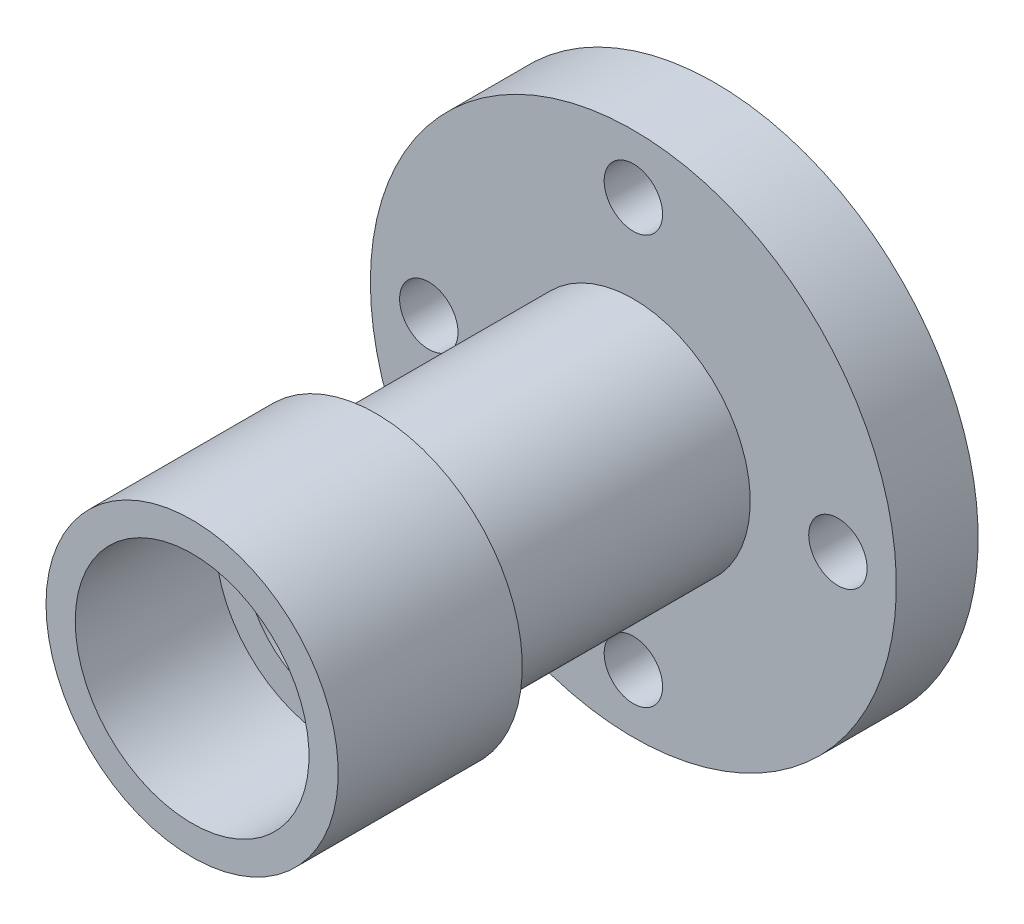
ISO-10303-21;
HEADER;
FILE_DESCRIPTION(('STEP AP214'),'2;1');
FILE_NAME('part.step','',(''),(''),'','','');
FILE_SCHEMA(('AUTOMOTIVE_DESIGN { 1 0 10303 214 1 1 1 1 }'));
ENDSEC;
DATA;
#1=APPLICATION_CONTEXT('core data for automotive mechanical design processes');
#2=APPLICATION_PROTOCOL_DEFINITION('international standard','automotive_design',2000,#1);
#3=PRODUCT_CONTEXT('',#1,'mechanical');
#4=PRODUCT('Part','Part','',(#3));
#5=PRODUCT_RELATED_PRODUCT_CATEGORY('part','',(#4));
#6=PRODUCT_DEFINITION_FORMATION('','',#4);
#7=PRODUCT_DEFINITION_CONTEXT('part definition',#1,'design');
#8=PRODUCT_DEFINITION('design','',#6,#7);
#9=PRODUCT_DEFINITION_SHAPE('','',#8);
#10=(LENGTH_UNIT() NAMED_UNIT(*) SI_UNIT(.MILLI.,.METRE.));
#11=(NAMED_UNIT(*) PLANE_ANGLE_UNIT() SI_UNIT($,.RADIAN.));
#12=(NAMED_UNIT(*) SI_UNIT($,.STERADIAN.) SOLID_ANGLE_UNIT());
#13=UNCERTAINTY_MEASURE_WITH_UNIT(LENGTH_MEASURE(1.E-05),#10,'distance_accuracy_value','');
#14=(GEOMETRIC_REPRESENTATION_CONTEXT(3) GLOBAL_UNCERTAINTY_ASSIGNED_CONTEXT((#13)) GLOBAL_UNIT_ASSIGNED_CONTEXT((#10,
#11,#12)) REPRESENTATION_CONTEXT('',''));
#15=CARTESIAN_POINT('',(0.,0.,0.));
#16=DIRECTION('',(0.,0.,1.));
#17=DIRECTION('',(1.,0.,0.));
#18=AXIS2_PLACEMENT_3D('',#15,#16,#17);
#19=CARTESIAN_POINT('',(0.,0.,-114.136596418696));
#20=DIRECTION('',(0.,0.,-1.));
#21=DIRECTION('',(-1.,0.,0.));
#22=AXIS2_PLACEMENT_3D('',#19,#20,#21);
#23=CYLINDRICAL_SURFACE('',#22,25.);
#24=CARTESIAN_POINT('',(0.,0.,0.));
#25=DIRECTION('',(0.,0.,-1.));
#26=DIRECTION('',(-1.,0.,0.));
#27=AXIS2_PLACEMENT_3D('',#24,#25,#26);
#28=CIRCLE('',#27,25.);
#29=CARTESIAN_POINT('',(-25.,0.,0.));
#30=VERTEX_POINT('',#29);
#31=EDGE_CURVE('E10',#30,#30,#28,.T.);
#32=ORIENTED_EDGE('',*,*,#31,.T.);
#33=EDGE_LOOP('',(#32));
#34=FACE_BOUND('',#33,.T.);
#35=CARTESIAN_POINT('',(0.,0.,-31.5));
#36=DIRECTION('',(0.,0.,-1.));
#37=DIRECTION('',(-1.,0.,0.));
#38=AXIS2_PLACEMENT_3D('',#35,#36,#37);
#39=CIRCLE('',#38,25.);
#40=CARTESIAN_POINT('',(-25.,0.,-31.5));
#41=VERTEX_POINT('',#40);
#42=EDGE_CURVE('E58',#41,#41,#39,.T.);
#43=ORIENTED_EDGE('',*,*,#42,.F.);
#44=EDGE_LOOP('',(#43));
#45=FACE_BOUND('',#44,.T.);
#46=ADVANCED_FACE('F31',(#34,#45),#23,.T.);
#47=CARTESIAN_POINT('',(0.,25.,0.));
#48=DIRECTION('',(0.,0.,1.));
#49=DIRECTION('',(1.,0.,0.));
#50=AXIS2_PLACEMENT_3D('',#47,#48,#49);
#51=PLANE('',#50);
#52=CARTESIAN_POINT('',(0.,0.,0.));
#53=DIRECTION('',(0.,0.,-1.));
#54=DIRECTION('',(-1.,0.,0.));
#55=AXIS2_PLACEMENT_3D('',#52,#53,#54);
#56=CIRCLE('',#55,20.);
#57=CARTESIAN_POINT('',(-20.,0.,0.));
#58=VERTEX_POINT('',#57);
#59=EDGE_CURVE('E38',#58,#58,#56,.T.);
#60=ORIENTED_EDGE('',*,*,#59,.T.);
#61=EDGE_LOOP('',(#60));
#62=FACE_BOUND('',#61,.T.);
#63=ORIENTED_EDGE('',*,*,#31,.F.);
#64=EDGE_LOOP('',(#63));
#65=FACE_BOUND('',#64,.T.);
#66=ADVANCED_FACE('F155',(#62,#65),#51,.T.);
#67=CARTESIAN_POINT('',(0.,0.,-114.136596418696));
#68=DIRECTION('',(0.,0.,-1.));
#69=DIRECTION('',(-1.,0.,0.));
#70=AXIS2_PLACEMENT_3D('',#67,#68,#69);
#71=CYLINDRICAL_SURFACE('',#70,20.);
#72=CARTESIAN_POINT('',(0.,0.,-24.));
#73=DIRECTION('',(0.,0.,-1.));
#74=DIRECTION('',(-1.,0.,0.));
#75=AXIS2_PLACEMENT_3D('',#72,#73,#74);
#76=CIRCLE('',#75,20.);
#77=CARTESIAN_POINT('',(-20.,0.,-24.));
#78=VERTEX_POINT('',#77);
#79=EDGE_CURVE('E43',#78,#78,#76,.T.);
#80=ORIENTED_EDGE('',*,*,#79,.T.);
#81=EDGE_LOOP('',(#80));
#82=FACE_BOUND('',#81,.T.);
#83=ORIENTED_EDGE('',*,*,#59,.F.);
#84=EDGE_LOOP('',(#83));
#85=FACE_BOUND('',#84,.T.);
#86=ADVANCED_FACE('F140',(#82,#85),#71,.F.);
#87=CARTESIAN_POINT('',(0.,20.,-24.));
#88=DIRECTION('',(0.,0.,1.));
#89=DIRECTION('',(1.,0.,0.));
#90=AXIS2_PLACEMENT_3D('',#87,#88,#89);
#91=PLANE('',#90);
#92=CARTESIAN_POINT('',(0.,0.,-24.));
#93=DIRECTION('',(0.,0.,-1.));
#94=DIRECTION('',(-1.,0.,0.));
#95=AXIS2_PLACEMENT_3D('',#92,#93,#94);
#96=CIRCLE('',#95,15.);
#97=CARTESIAN_POINT('',(-15.,0.,-24.));
#98=VERTEX_POINT('',#97);
#99=EDGE_CURVE('E135',#98,#98,#96,.T.);
#100=ORIENTED_EDGE('',*,*,#99,.T.);
#101=EDGE_LOOP('',(#100));
#102=FACE_BOUND('',#101,.T.);
#103=ORIENTED_EDGE('',*,*,#79,.F.);
#104=EDGE_LOOP('',(#103));
#105=FACE_BOUND('',#104,.T.);
#106=ADVANCED_FACE('F143',(#102,#105),#91,.T.);
#107=CARTESIAN_POINT('',(0.,0.,-114.136596418696));
#108=DIRECTION('',(0.,0.,-1.));
#109=DIRECTION('',(-1.,0.,0.));
#110=AXIS2_PLACEMENT_3D('',#107,#108,#109);
#111=CYLINDRICAL_SURFACE('',#110,15.);
#112=CARTESIAN_POINT('',(0.,0.,-33.4999999999998));
#113=DIRECTION('',(0.,0.,-1.));
#114=DIRECTION('',(-1.,0.,0.));
#115=AXIS2_PLACEMENT_3D('',#112,#113,#114);
#116=CIRCLE('',#115,15.);
#117=CARTESIAN_POINT('',(-15.,0.,-33.4999999999998));
#118=VERTEX_POINT('',#117);
#119=EDGE_CURVE('E132',#118,#118,#116,.T.);
#120=ORIENTED_EDGE('',*,*,#119,.T.);
#121=EDGE_LOOP('',(#120));
#122=FACE_BOUND('',#121,.T.);
#123=ORIENTED_EDGE('',*,*,#99,.F.);
#124=EDGE_LOOP('',(#123));
#125=FACE_BOUND('',#124,.T.);
#126=ADVANCED_FACE('F145',(#122,#125),#111,.F.);
#127=CARTESIAN_POINT('',(0.,15.,-33.4999999999999));
#128=DIRECTION('',(0.,0.,-1.));
#129=DIRECTION('',(-1.,0.,0.));
#130=AXIS2_PLACEMENT_3D('',#127,#128,#129);
#131=PLANE('',#130);
#132=CARTESIAN_POINT('',(0.,0.,-33.5));
#133=DIRECTION('',(0.,0.,-1.));
#134=DIRECTION('',(-1.,0.,0.));
#135=AXIS2_PLACEMENT_3D('',#132,#133,#134);
#136=CIRCLE('',#135,17.);
#137=CARTESIAN_POINT('',(-17.,0.,-33.5));
#138=VERTEX_POINT('',#137);
#139=EDGE_CURVE('E129',#138,#138,#136,.T.);
#140=ORIENTED_EDGE('',*,*,#139,.T.);
#141=EDGE_LOOP('',(#140));
#142=FACE_BOUND('',#141,.T.);
#143=ORIENTED_EDGE('',*,*,#119,.F.);
#144=EDGE_LOOP('',(#143));
#145=FACE_BOUND('',#144,.T.);
#146=ADVANCED_FACE('F152',(#142,#145),#131,.T.);
#147=CARTESIAN_POINT('',(0.,0.,-114.136596418696));
#148=DIRECTION('',(0.,0.,-1.));
#149=DIRECTION('',(-1.,0.,0.));
#150=AXIS2_PLACEMENT_3D('',#147,#148,#149);
#151=CYLINDRICAL_SURFACE('',#150,17.);
#152=CARTESIAN_POINT('',(0.,0.,-35.5));
#153=DIRECTION('',(0.,0.,-1.));
#154=DIRECTION('',(-1.,0.,0.));
#155=AXIS2_PLACEMENT_3D('',#152,#153,#154);
#156=CIRCLE('',#155,17.);
#157=CARTESIAN_POINT('',(-17.,0.,-35.5));
#158=VERTEX_POINT('',#157);
#159=EDGE_CURVE('E126',#158,#158,#156,.T.);
#160=ORIENTED_EDGE('',*,*,#159,.T.);
#161=EDGE_LOOP('',(#160));
#162=FACE_BOUND('',#161,.T.);
#163=ORIENTED_EDGE('',*,*,#139,.F.);
#164=EDGE_LOOP('',(#163));
#165=FACE_BOUND('',#164,.T.);
#166=ADVANCED_FACE('F190',(#162,#165),#151,.F.);
#167=CARTESIAN_POINT('',(0.,17.,-35.5));
#168=DIRECTION('',(0.,0.,1.));
#169=DIRECTION('',(1.,0.,0.));
#170=AXIS2_PLACEMENT_3D('',#167,#168,#169);
#171=PLANE('',#170);
#172=CARTESIAN_POINT('',(0.,0.,-35.5));
#173=DIRECTION('',(0.,0.,-1.));
#174=DIRECTION('',(-1.,0.,0.));
#175=AXIS2_PLACEMENT_3D('',#172,#173,#174);
#176=CIRCLE('',#175,15.);
#177=CARTESIAN_POINT('',(-15.,0.,-35.5));
#178=VERTEX_POINT('',#177);
#179=EDGE_CURVE('E123',#178,#178,#176,.T.);
#180=ORIENTED_EDGE('',*,*,#179,.T.);
#181=EDGE_LOOP('',(#180));
#182=FACE_BOUND('',#181,.T.);
#183=ORIENTED_EDGE('',*,*,#159,.F.);
#184=EDGE_LOOP('',(#183));
#185=FACE_BOUND('',#184,.T.);
#186=ADVANCED_FACE('F200',(#182,#185),#171,.T.);
#187=CARTESIAN_POINT('',(0.,0.,-114.136596418696));
#188=DIRECTION('',(0.,0.,-1.));
#189=DIRECTION('',(-1.,0.,0.));
#190=AXIS2_PLACEMENT_3D('',#187,#188,#189);
#191=CYLINDRICAL_SURFACE('',#190,15.);
#192=CARTESIAN_POINT('',(0.,0.,-48.));
#193=DIRECTION('',(0.,0.,-1.));
#194=DIRECTION('',(-1.,0.,0.));
#195=AXIS2_PLACEMENT_3D('',#192,#193,#194);
#196=CIRCLE('',#195,15.);
#197=CARTESIAN_POINT('',(-15.,0.,-48.));
#198=VERTEX_POINT('',#197);
#199=EDGE_CURVE('E120',#198,#198,#196,.T.);
#200=ORIENTED_EDGE('',*,*,#199,.T.);
#201=EDGE_LOOP('',(#200));
#202=FACE_BOUND('',#201,.T.);
#203=ORIENTED_EDGE('',*,*,#179,.F.);
#204=EDGE_LOOP('',(#203));
#205=FACE_BOUND('',#204,.T.);
#206=ADVANCED_FACE('F210',(#202,#205),#191,.F.);
#207=CARTESIAN_POINT('',(0.,15.,-48.));
#208=DIRECTION('',(0.,0.,-1.));
#209=DIRECTION('',(-1.,0.,0.));
#210=AXIS2_PLACEMENT_3D('',#207,#208,#209);
#211=PLANE('',#210);
#212=CARTESIAN_POINT('',(0.,0.,-48.));
#213=DIRECTION('',(0.,0.,-1.));
#214=DIRECTION('',(-1.,0.,0.));
#215=AXIS2_PLACEMENT_3D('',#212,#213,#214);
#216=CIRCLE('',#215,18.5);
#217=CARTESIAN_POINT('',(-18.5,0.,-48.));
#218=VERTEX_POINT('',#217);
#219=EDGE_CURVE('E117',#218,#218,#216,.T.);
#220=ORIENTED_EDGE('',*,*,#219,.T.);
#221=EDGE_LOOP('',(#220));
#222=FACE_BOUND('',#221,.T.);
#223=ORIENTED_EDGE('',*,*,#199,.F.);
#224=EDGE_LOOP('',(#223));
#225=FACE_BOUND('',#224,.T.);
#226=ADVANCED_FACE('F220',(#222,#225),#211,.T.);
#227=CARTESIAN_POINT('',(0.,0.,-114.136596418696));
#228=DIRECTION('',(0.,0.,-1.));
#229=DIRECTION('',(-1.,0.,0.));
#230=AXIS2_PLACEMENT_3D('',#227,#228,#229);
#231=CYLINDRICAL_SURFACE('',#230,18.5);
#232=CARTESIAN_POINT('',(0.,0.,-51.5));
#233=DIRECTION('',(0.,0.,-1.));
#234=DIRECTION('',(-1.,0.,0.));
#235=AXIS2_PLACEMENT_3D('',#232,#233,#234);
#236=CIRCLE('',#235,18.5);
#237=CARTESIAN_POINT('',(-18.5,0.,-51.5));
#238=VERTEX_POINT('',#237);
#239=EDGE_CURVE('E114',#238,#238,#236,.T.);
#240=ORIENTED_EDGE('',*,*,#239,.T.);
#241=EDGE_LOOP('',(#240));
#242=FACE_BOUND('',#241,.T.);
#243=ORIENTED_EDGE('',*,*,#219,.F.);
#244=EDGE_LOOP('',(#243));
#245=FACE_BOUND('',#244,.T.);
#246=ADVANCED_FACE('F230',(#242,#245),#231,.F.);
#247=CARTESIAN_POINT('',(0.,18.5,-51.5));
#248=DIRECTION('',(0.,0.,1.));
#249=DIRECTION('',(1.,0.,0.));
#250=AXIS2_PLACEMENT_3D('',#247,#248,#249);
#251=PLANE('',#250);
#252=CARTESIAN_POINT('',(0.,0.,-51.5));
#253=DIRECTION('',(0.,0.,-1.));
#254=DIRECTION('',(-1.,0.,0.));
#255=AXIS2_PLACEMENT_3D('',#252,#253,#254);
#256=CIRCLE('',#255,15.);
#257=CARTESIAN_POINT('',(-15.,0.,-51.5));
#258=VERTEX_POINT('',#257);
#259=EDGE_CURVE('E111',#258,#258,#256,.T.);
#260=ORIENTED_EDGE('',*,*,#259,.T.);
#261=EDGE_LOOP('',(#260));
#262=FACE_BOUND('',#261,.T.);
#263=ORIENTED_EDGE('',*,*,#239,.F.);
#264=EDGE_LOOP('',(#263));
#265=FACE_BOUND('',#264,.T.);
#266=ADVANCED_FACE('F240',(#262,#265),#251,.T.);
#267=CARTESIAN_POINT('',(0.,0.,-114.136596418696));
#268=DIRECTION('',(0.,0.,-1.));
#269=DIRECTION('',(-1.,0.,0.));
#270=AXIS2_PLACEMENT_3D('',#267,#268,#269);
#271=CYLINDRICAL_SURFACE('',#270,15.);
#272=CARTESIAN_POINT('',(0.,0.,-63.5));
#273=DIRECTION('',(0.,0.,-1.));
#274=DIRECTION('',(-1.,0.,0.));
#275=AXIS2_PLACEMENT_3D('',#272,#273,#274);
#276=CIRCLE('',#275,15.);
#277=CARTESIAN_POINT('',(-15.,0.,-63.5));
#278=VERTEX_POINT('',#277);
#279=EDGE_CURVE('E108',#278,#278,#276,.T.);
#280=ORIENTED_EDGE('',*,*,#279,.T.);
#281=EDGE_LOOP('',(#280));
#282=FACE_BOUND('',#281,.T.);
#283=ORIENTED_EDGE('',*,*,#259,.F.);
#284=EDGE_LOOP('',(#283));
#285=FACE_BOUND('',#284,.T.);
#286=ADVANCED_FACE('F250',(#282,#285),#271,.F.);
#287=CARTESIAN_POINT('',(0.,15.,-63.5));
#288=DIRECTION('',(0.,0.,-1.));
#289=DIRECTION('',(-1.,0.,0.));
#290=AXIS2_PLACEMENT_3D('',#287,#288,#289);
#291=PLANE('',#290);
#292=CARTESIAN_POINT('',(0.,0.,-63.5));
#293=DIRECTION('',(0.,0.,-1.));
#294=DIRECTION('',(-1.,0.,0.));
#295=AXIS2_PLACEMENT_3D('',#292,#293,#294);
#296=CIRCLE('',#295,17.);
#297=CARTESIAN_POINT('',(-17.,0.,-63.5));
#298=VERTEX_POINT('',#297);
#299=EDGE_CURVE('E105',#298,#298,#296,.T.);
#300=ORIENTED_EDGE('',*,*,#299,.T.);
#301=EDGE_LOOP('',(#300));
#302=FACE_BOUND('',#301,.T.);
#303=ORIENTED_EDGE('',*,*,#279,.F.);
#304=EDGE_LOOP('',(#303));
#305=FACE_BOUND('',#304,.T.);
#306=ADVANCED_FACE('F260',(#302,#305),#291,.T.);
#307=CARTESIAN_POINT('',(0.,0.,-114.136596418696));
#308=DIRECTION('',(0.,0.,-1.));
#309=DIRECTION('',(-1.,0.,0.));
#310=AXIS2_PLACEMENT_3D('',#307,#308,#309);
#311=CYLINDRICAL_SURFACE('',#310,17.);
#312=CARTESIAN_POINT('',(0.,0.,-65.5));
#313=DIRECTION('',(0.,0.,-1.));
#314=DIRECTION('',(-1.,0.,0.));
#315=AXIS2_PLACEMENT_3D('',#312,#313,#314);
#316=CIRCLE('',#315,17.);
#317=CARTESIAN_POINT('',(-17.,0.,-65.5));
#318=VERTEX_POINT('',#317);
#319=EDGE_CURVE('E102',#318,#318,#316,.T.);
#320=ORIENTED_EDGE('',*,*,#319,.T.);
#321=EDGE_LOOP('',(#320));
#322=FACE_BOUND('',#321,.T.);
#323=ORIENTED_EDGE('',*,*,#299,.F.);
#324=EDGE_LOOP('',(#323));
#325=FACE_BOUND('',#324,.T.);
#326=ADVANCED_FACE('F270',(#322,#325),#311,.F.);
#327=CARTESIAN_POINT('',(0.,17.,-65.5));
#328=DIRECTION('',(0.,0.,1.));
#329=DIRECTION('',(1.,0.,0.));
#330=AXIS2_PLACEMENT_3D('',#327,#328,#329);
#331=PLANE('',#330);
#332=CARTESIAN_POINT('',(0.,0.,-65.5));
#333=DIRECTION('',(0.,0.,-1.));
#334=DIRECTION('',(-1.,0.,0.));
#335=AXIS2_PLACEMENT_3D('',#332,#333,#334);
#336=CIRCLE('',#335,15.);
#337=CARTESIAN_POINT('',(-15.,0.,-65.5));
#338=VERTEX_POINT('',#337);
#339=EDGE_CURVE('E99',#338,#338,#336,.T.);
#340=ORIENTED_EDGE('',*,*,#339,.T.);
#341=EDGE_LOOP('',(#340));
#342=FACE_BOUND('',#341,.T.);
#343=ORIENTED_EDGE('',*,*,#319,.F.);
#344=EDGE_LOOP('',(#343));
#345=FACE_BOUND('',#344,.T.);
#346=ADVANCED_FACE('F280',(#342,#345),#331,.T.);
#347=CARTESIAN_POINT('',(0.,0.,-114.136596418696));
#348=DIRECTION('',(0.,0.,-1.));
#349=DIRECTION('',(-1.,0.,0.));
#350=AXIS2_PLACEMENT_3D('',#347,#348,#349);
#351=CYLINDRICAL_SURFACE('',#350,15.);
#352=CARTESIAN_POINT('',(0.,0.,-86.));
#353=DIRECTION('',(0.,0.,-1.));
#354=DIRECTION('',(-1.,0.,0.));
#355=AXIS2_PLACEMENT_3D('',#352,#353,#354);
#356=CIRCLE('',#355,15.);
#357=CARTESIAN_POINT('',(-15.,0.,-86.));
#358=VERTEX_POINT('',#357);
#359=EDGE_CURVE('E96',#358,#358,#356,.T.);
#360=ORIENTED_EDGE('',*,*,#359,.T.);
#361=EDGE_LOOP('',(#360));
#362=FACE_BOUND('',#361,.T.);
#363=ORIENTED_EDGE('',*,*,#339,.F.);
#364=EDGE_LOOP('',(#363));
#365=FACE_BOUND('',#364,.T.);
#366=ADVANCED_FACE('F290',(#362,#365),#351,.F.);
#367=CARTESIAN_POINT('',(0.,0.,-86.));
#368=DIRECTION('',(0.,0.,-1.));
#369=DIRECTION('',(-1.,0.,0.));
#370=AXIS2_PLACEMENT_3D('',#367,#368,#369);
#371=CONICAL_SURFACE('',#370,15.,0.785398163397448);
#372=CARTESIAN_POINT('',(0.,0.,-89.5));
#373=DIRECTION('',(0.,0.,-1.));
#374=DIRECTION('',(-1.,0.,0.));
#375=AXIS2_PLACEMENT_3D('',#372,#373,#374);
#376=CIRCLE('',#375,18.5);
#377=CARTESIAN_POINT('',(-18.5,0.,-89.5));
#378=VERTEX_POINT('',#377);
#379=EDGE_CURVE('E93',#378,#378,#376,.T.);
#380=ORIENTED_EDGE('',*,*,#379,.T.);
#381=EDGE_LOOP('',(#380));
#382=FACE_BOUND('',#381,.T.);
#383=ORIENTED_EDGE('',*,*,#359,.F.);
#384=EDGE_LOOP('',(#383));
#385=FACE_BOUND('',#384,.T.);
#386=ADVANCED_FACE('F300',(#382,#385),#371,.F.);
#387=CARTESIAN_POINT('',(0.,18.5,-89.5));
#388=DIRECTION('',(0.,0.,-1.));
#389=DIRECTION('',(-1.,0.,0.));
#390=AXIS2_PLACEMENT_3D('',#387,#388,#389);
#391=PLANE('',#390);
#392=CARTESIAN_POINT('',(0.,0.,-89.5));
#393=DIRECTION('',(0.,0.,-1.));
#394=DIRECTION('',(-1.,0.,0.));
#395=AXIS2_PLACEMENT_3D('',#392,#393,#394);
#396=CIRCLE('',#395,23.);
#397=CARTESIAN_POINT('',(-23.,0.,-89.5));
#398=VERTEX_POINT('',#397);
#399=EDGE_CURVE('E90',#398,#398,#396,.T.);
#400=ORIENTED_EDGE('',*,*,#399,.T.);
#401=EDGE_LOOP('',(#400));
#402=FACE_BOUND('',#401,.T.);
#403=ORIENTED_EDGE('',*,*,#379,.F.);
#404=EDGE_LOOP('',(#403));
#405=FACE_BOUND('',#404,.T.);
#406=ADVANCED_FACE('F310',(#402,#405),#391,.T.);
#407=CARTESIAN_POINT('',(0.,0.,-114.136596418696));
#408=DIRECTION('',(0.,0.,-1.));
#409=DIRECTION('',(-1.,0.,0.));
#410=AXIS2_PLACEMENT_3D('',#407,#408,#409);
#411=CYLINDRICAL_SURFACE('',#410,23.);
#412=CARTESIAN_POINT('',(0.,0.,-83.5));
#413=DIRECTION('',(0.,0.,-1.));
#414=DIRECTION('',(-1.,0.,0.));
#415=AXIS2_PLACEMENT_3D('',#412,#413,#414);
#416=CIRCLE('',#415,23.);
#417=CARTESIAN_POINT('',(-23.,0.,-83.5));
#418=VERTEX_POINT('',#417);
#419=EDGE_CURVE('E87',#418,#418,#416,.T.);
#420=ORIENTED_EDGE('',*,*,#419,.T.);
#421=EDGE_LOOP('',(#420));
#422=FACE_BOUND('',#421,.T.);
#423=ORIENTED_EDGE('',*,*,#399,.F.);
#424=EDGE_LOOP('',(#423));
#425=FACE_BOUND('',#424,.T.);
#426=ADVANCED_FACE('F320',(#422,#425),#411,.T.);
#427=CARTESIAN_POINT('',(0.,23.,-83.5));
#428=DIRECTION('',(0.,0.,-1.));
#429=DIRECTION('',(-1.,0.,0.));
#430=AXIS2_PLACEMENT_3D('',#427,#428,#429);
#431=PLANE('',#430);
#432=CARTESIAN_POINT('',(0.,0.,-83.5));
#433=DIRECTION('',(0.,0.,-1.));
#434=DIRECTION('',(-1.,0.,0.));
#435=AXIS2_PLACEMENT_3D('',#432,#433,#434);
#436=CIRCLE('',#435,27.);
#437=CARTESIAN_POINT('',(-27.,0.,-83.5));
#438=VERTEX_POINT('',#437);
#439=EDGE_CURVE('E84',#438,#438,#436,.T.);
#440=ORIENTED_EDGE('',*,*,#439,.T.);
#441=EDGE_LOOP('',(#440));
#442=FACE_BOUND('',#441,.T.);
#443=ORIENTED_EDGE('',*,*,#419,.F.);
#444=EDGE_LOOP('',(#443));
#445=FACE_BOUND('',#444,.T.);
#446=ADVANCED_FACE('F330',(#442,#445),#431,.T.);
#447=CARTESIAN_POINT('',(0.,0.,-114.136596418696));
#448=DIRECTION('',(0.,0.,-1.));
#449=DIRECTION('',(-1.,0.,0.));
#450=AXIS2_PLACEMENT_3D('',#447,#448,#449);
#451=CYLINDRICAL_SURFACE('',#450,27.);
#452=CARTESIAN_POINT('',(0.,0.,-89.5));
#453=DIRECTION('',(0.,0.,-1.));
#454=DIRECTION('',(-1.,0.,0.));
#455=AXIS2_PLACEMENT_3D('',#452,#453,#454);
#456=CIRCLE('',#455,27.);
#457=CARTESIAN_POINT('',(-27.,0.,-89.5));
#458=VERTEX_POINT('',#457);
#459=EDGE_CURVE('E81',#458,#458,#456,.T.);
#460=ORIENTED_EDGE('',*,*,#459,.T.);
#461=EDGE_LOOP('',(#460));
#462=FACE_BOUND('',#461,.T.);
#463=ORIENTED_EDGE('',*,*,#439,.F.);
#464=EDGE_LOOP('',(#463));
#465=FACE_BOUND('',#464,.T.);
#466=ADVANCED_FACE('F340',(#462,#465),#451,.F.);
#467=CARTESIAN_POINT('',(0.,27.,-89.5));
#468=DIRECTION('',(0.,0.,-1.));
#469=DIRECTION('',(-1.,0.,0.));
#470=AXIS2_PLACEMENT_3D('',#467,#468,#469);
#471=PLANE('',#470);
#472=CARTESIAN_POINT('',(0.,35.,-89.5));
#473=DIRECTION('',(0.,0.,-1.));
#474=DIRECTION('',(-1.,0.,0.));
#475=AXIS2_PLACEMENT_3D('',#472,#473,#474);
#476=CIRCLE('',#475,5.);
#477=CARTESIAN_POINT('',(-5.,35.,-89.5));
#478=VERTEX_POINT('',#477);
#479=EDGE_CURVE('E51',#478,#478,#476,.T.);
#480=ORIENTED_EDGE('',*,*,#479,.F.);
#481=EDGE_LOOP('',(#480));
#482=FACE_BOUND('',#481,.T.);
#483=CARTESIAN_POINT('',(-35.,0.,-89.5));
#484=DIRECTION('',(0.,0.,-1.));
#485=DIRECTION('',(-1.,0.,0.));
#486=AXIS2_PLACEMENT_3D('',#483,#484,#485);
#487=CIRCLE('',#486,5.);
#488=CARTESIAN_POINT('',(-40.,0.,-89.5));
#489=VERTEX_POINT('',#488);
#490=EDGE_CURVE('E444',#489,#489,#487,.T.);
#491=ORIENTED_EDGE('',*,*,#490,.F.);
#492=EDGE_LOOP('',(#491));
#493=FACE_BOUND('',#492,.T.);
#494=CARTESIAN_POINT('',(0.,-35.,-89.5));
#495=DIRECTION('',(0.,0.,-1.));
#496=DIRECTION('',(-1.,0.,0.));
#497=AXIS2_PLACEMENT_3D('',#494,#495,#496);
#498=CIRCLE('',#497,5.);
#499=CARTESIAN_POINT('',(-5.,-35.,-89.5));
#500=VERTEX_POINT('',#499);
#501=EDGE_CURVE('E447',#500,#500,#498,.T.);
#502=ORIENTED_EDGE('',*,*,#501,.F.);
#503=EDGE_LOOP('',(#502));
#504=FACE_BOUND('',#503,.T.);
#505=CARTESIAN_POINT('',(35.,0.,-89.5));
#506=DIRECTION('',(0.,0.,-1.));
#507=DIRECTION('',(-1.,0.,0.));
#508=AXIS2_PLACEMENT_3D('',#505,#506,#507);
#509=CIRCLE('',#508,5.);
#510=CARTESIAN_POINT('',(30.,0.,-89.5));
#511=VERTEX_POINT('',#510);
#512=EDGE_CURVE('E70',#511,#511,#509,.T.);
#513=ORIENTED_EDGE('',*,*,#512,.F.);
#514=EDGE_LOOP('',(#513));
#515=FACE_BOUND('',#514,.T.);
#516=CARTESIAN_POINT('',(0.,0.,-89.5));
#517=DIRECTION('',(0.,0.,-1.));
#518=DIRECTION('',(-1.,0.,0.));
#519=AXIS2_PLACEMENT_3D('',#516,#517,#518);
#520=CIRCLE('',#519,45.);
#521=CARTESIAN_POINT('',(-45.,0.,-89.5));
#522=VERTEX_POINT('',#521);
#523=EDGE_CURVE('E78',#522,#522,#520,.T.);
#524=ORIENTED_EDGE('',*,*,#523,.T.);
#525=EDGE_LOOP('',(#524));
#526=FACE_BOUND('',#525,.T.);
#527=ORIENTED_EDGE('',*,*,#459,.F.);
#528=EDGE_LOOP('',(#527));
#529=FACE_BOUND('',#528,.T.);
#530=ADVANCED_FACE('F350',(#482,#493,#504,#515,#526,#529),#471,.T.);
#531=CARTESIAN_POINT('',(0.,0.,-114.136596418696));
#532=DIRECTION('',(0.,0.,-1.));
#533=DIRECTION('',(-1.,0.,0.));
#534=AXIS2_PLACEMENT_3D('',#531,#532,#533);
#535=CYLINDRICAL_SURFACE('',#534,45.);
#536=CARTESIAN_POINT('',(0.,0.,-75.5));
#537=DIRECTION('',(0.,0.,-1.));
#538=DIRECTION('',(-1.,0.,0.));
#539=AXIS2_PLACEMENT_3D('',#536,#537,#538);
#540=CIRCLE('',#539,45.);
#541=CARTESIAN_POINT('',(-45.,0.,-75.5));
#542=VERTEX_POINT('',#541);
#543=EDGE_CURVE('E75',#542,#542,#540,.T.);
#544=ORIENTED_EDGE('',*,*,#543,.T.);
#545=EDGE_LOOP('',(#544));
#546=FACE_BOUND('',#545,.T.);
#547=ORIENTED_EDGE('',*,*,#523,.F.);
#548=EDGE_LOOP('',(#547));
#549=FACE_BOUND('',#548,.T.);
#550=ADVANCED_FACE('F358',(#546,#549),#535,.T.);
#551=CARTESIAN_POINT('',(0.,45.,-75.5));
#552=DIRECTION('',(0.,0.,1.));
#553=DIRECTION('',(1.,0.,0.));
#554=AXIS2_PLACEMENT_3D('',#551,#552,#553);
#555=PLANE('',#554);
#556=CARTESIAN_POINT('',(0.,35.,-75.5));
#557=DIRECTION('',(0.,0.,1.));
#558=DIRECTION('',(1.,0.,0.));
#559=AXIS2_PLACEMENT_3D('',#556,#557,#558);
#560=CIRCLE('',#559,5.);
#561=CARTESIAN_POINT('',(-5.,35.,-75.5));
#562=VERTEX_POINT('',#561);
#563=EDGE_CURVE('E34',#562,#562,#560,.T.);
#564=ORIENTED_EDGE('',*,*,#563,.F.);
#565=EDGE_LOOP('',(#564));
#566=FACE_BOUND('',#565,.T.);
#567=CARTESIAN_POINT('',(-35.,0.,-75.5));
#568=DIRECTION('',(0.,0.,1.));
#569=DIRECTION('',(1.,0.,0.));
#570=AXIS2_PLACEMENT_3D('',#567,#568,#569);
#571=CIRCLE('',#570,5.);
#572=CARTESIAN_POINT('',(-40.,0.,-75.5));
#573=VERTEX_POINT('',#572);
#574=EDGE_CURVE('E53',#573,#573,#571,.T.);
#575=ORIENTED_EDGE('',*,*,#574,.F.);
#576=EDGE_LOOP('',(#575));
#577=FACE_BOUND('',#576,.T.);
#578=CARTESIAN_POINT('',(0.,-35.,-75.5));
#579=DIRECTION('',(0.,0.,1.));
#580=DIRECTION('',(1.,0.,0.));
#581=AXIS2_PLACEMENT_3D('',#578,#579,#580);
#582=CIRCLE('',#581,5.);
#583=CARTESIAN_POINT('',(-5.,-35.,-75.5));
#584=VERTEX_POINT('',#583);
#585=EDGE_CURVE('E50',#584,#584,#582,.T.);
#586=ORIENTED_EDGE('',*,*,#585,.F.);
#587=EDGE_LOOP('',(#586));
#588=FACE_BOUND('',#587,.T.);
#589=CARTESIAN_POINT('',(35.,0.,-75.5));
#590=DIRECTION('',(0.,0.,1.));
#591=DIRECTION('',(1.,0.,0.));
#592=AXIS2_PLACEMENT_3D('',#589,#590,#591);
#593=CIRCLE('',#592,5.);
#594=CARTESIAN_POINT('',(30.,0.,-75.5));
#595=VERTEX_POINT('',#594);
#596=EDGE_CURVE('E47',#595,#595,#593,.T.);
#597=ORIENTED_EDGE('',*,*,#596,.F.);
#598=EDGE_LOOP('',(#597));
#599=FACE_BOUND('',#598,.T.);
#600=CARTESIAN_POINT('',(0.,0.,-75.5));
#601=DIRECTION('',(0.,0.,-1.));
#602=DIRECTION('',(-1.,0.,0.));
#603=AXIS2_PLACEMENT_3D('',#600,#601,#602);
#604=CIRCLE('',#603,20.);
#605=CARTESIAN_POINT('',(-20.,0.,-75.5));
#606=VERTEX_POINT('',#605);
#607=EDGE_CURVE('E67',#606,#606,#604,.T.);
#608=ORIENTED_EDGE('',*,*,#607,.T.);
#609=EDGE_LOOP('',(#608));
#610=FACE_BOUND('',#609,.T.);
#611=ORIENTED_EDGE('',*,*,#543,.F.);
#612=EDGE_LOOP('',(#611));
#613=FACE_BOUND('',#612,.T.);
#614=ADVANCED_FACE('F363',(#566,#577,#588,#599,#610,#613),#555,.T.);
#615=CARTESIAN_POINT('',(0.,0.,-114.136596418696));
#616=DIRECTION('',(0.,0.,-1.));
#617=DIRECTION('',(-1.,0.,0.));
#618=AXIS2_PLACEMENT_3D('',#615,#616,#617);
#619=CYLINDRICAL_SURFACE('',#618,20.);
#620=CARTESIAN_POINT('',(0.,0.,-31.5));
#621=DIRECTION('',(0.,0.,-1.));
#622=DIRECTION('',(-1.,0.,0.));
#623=AXIS2_PLACEMENT_3D('',#620,#621,#622);
#624=CIRCLE('',#623,20.);
#625=CARTESIAN_POINT('',(-20.,0.,-31.5));
#626=VERTEX_POINT('',#625);
#627=EDGE_CURVE('E62',#626,#626,#624,.T.);
#628=ORIENTED_EDGE('',*,*,#627,.T.);
#629=EDGE_LOOP('',(#628));
#630=FACE_BOUND('',#629,.T.);
#631=ORIENTED_EDGE('',*,*,#607,.F.);
#632=EDGE_LOOP('',(#631));
#633=FACE_BOUND('',#632,.T.);
#634=ADVANCED_FACE('F371',(#630,#633),#619,.T.);
#635=CARTESIAN_POINT('',(0.,20.,-31.5));
#636=DIRECTION('',(0.,0.,-1.));
#637=DIRECTION('',(-1.,0.,0.));
#638=AXIS2_PLACEMENT_3D('',#635,#636,#637);
#639=PLANE('',#638);
#640=ORIENTED_EDGE('',*,*,#42,.T.);
#641=EDGE_LOOP('',(#640));
#642=FACE_BOUND('',#641,.T.);
#643=ORIENTED_EDGE('',*,*,#627,.F.);
#644=EDGE_LOOP('',(#643));
#645=FACE_BOUND('',#644,.T.);
#646=ADVANCED_FACE('F376',(#642,#645),#639,.T.);
#647=CARTESIAN_POINT('',(35.,0.,0.));
#648=DIRECTION('',(0.,0.,-1.));
#649=DIRECTION('',(-1.,0.,0.));
#650=AXIS2_PLACEMENT_3D('',#647,#648,#649);
#651=CYLINDRICAL_SURFACE('',#650,5.);
#652=CARTESIAN_POINT('',(30.,0.,-75.5));
#653=CARTESIAN_POINT('',(30.,0.,-75.6458333333333));
#654=CARTESIAN_POINT('',(30.,0.,-75.7916666666667));
#655=CARTESIAN_POINT('',(30.,0.,-76.0833333333333));
#656=CARTESIAN_POINT('',(30.,0.,-76.2291666666667));
#657=CARTESIAN_POINT('',(30.,0.,-76.5208333333333));
#658=CARTESIAN_POINT('',(30.,0.,-76.6666666666667));
#659=CARTESIAN_POINT('',(30.,0.,-76.9583333333333));
#660=CARTESIAN_POINT('',(30.,0.,-77.1041666666667));
#661=CARTESIAN_POINT('',(30.,0.,-77.3958333333333));
#662=CARTESIAN_POINT('',(30.,0.,-77.5416666666667));
#663=CARTESIAN_POINT('',(30.,0.,-77.8333333333333));
#664=CARTESIAN_POINT('',(30.,0.,-77.9791666666667));
#665=CARTESIAN_POINT('',(30.,0.,-78.2708333333333));
#666=CARTESIAN_POINT('',(30.,0.,-78.4166666666667));
#667=CARTESIAN_POINT('',(30.,0.,-78.7083333333333));
#668=CARTESIAN_POINT('',(30.,0.,-78.8541666666667));
#669=CARTESIAN_POINT('',(30.,0.,-79.1458333333333));
#670=CARTESIAN_POINT('',(30.,0.,-79.2916666666667));
#671=CARTESIAN_POINT('',(30.,0.,-79.5833333333333));
#672=CARTESIAN_POINT('',(30.,0.,-79.7291666666667));
#673=CARTESIAN_POINT('',(30.,0.,-80.0208333333333));
#674=CARTESIAN_POINT('',(30.,0.,-80.1666666666667));
#675=CARTESIAN_POINT('',(30.,0.,-80.4583333333333));
#676=CARTESIAN_POINT('',(30.,0.,-80.6041666666667));
#677=CARTESIAN_POINT('',(30.,0.,-80.8958333333333));
#678=CARTESIAN_POINT('',(30.,0.,-81.0416666666667));
#679=CARTESIAN_POINT('',(30.,0.,-81.3333333333333));
#680=CARTESIAN_POINT('',(30.,0.,-81.4791666666667));
#681=CARTESIAN_POINT('',(30.,0.,-81.7708333333333));
#682=CARTESIAN_POINT('',(30.,0.,-81.9166666666667));
#683=CARTESIAN_POINT('',(30.,0.,-82.2083333333333));
#684=CARTESIAN_POINT('',(30.,0.,-82.3541666666667));
#685=CARTESIAN_POINT('',(30.,0.,-82.6458333333333));
#686=CARTESIAN_POINT('',(30.,0.,-82.7916666666667));
#687=CARTESIAN_POINT('',(30.,0.,-83.0833333333333));
#688=CARTESIAN_POINT('',(30.,0.,-83.2291666666667));
#689=CARTESIAN_POINT('',(30.,0.,-83.5208333333333));
#690=CARTESIAN_POINT('',(30.,0.,-83.6666666666667));
#691=CARTESIAN_POINT('',(30.,0.,-83.9583333333333));
#692=CARTESIAN_POINT('',(30.,0.,-84.1041666666667));
#693=CARTESIAN_POINT('',(30.,0.,-84.3958333333333));
#694=CARTESIAN_POINT('',(30.,0.,-84.5416666666667));
#695=CARTESIAN_POINT('',(30.,0.,-84.8333333333333));
#696=CARTESIAN_POINT('',(30.,0.,-84.9791666666667));
#697=CARTESIAN_POINT('',(30.,0.,-85.2708333333333));
#698=CARTESIAN_POINT('',(30.,0.,-85.4166666666667));
#699=CARTESIAN_POINT('',(30.,0.,-85.7083333333333));
#700=CARTESIAN_POINT('',(30.,0.,-85.8541666666666));
#701=CARTESIAN_POINT('',(30.,0.,-86.1458333333333));
#702=CARTESIAN_POINT('',(30.,0.,-86.2916666666667));
#703=CARTESIAN_POINT('',(30.,0.,-86.5833333333333));
#704=CARTESIAN_POINT('',(30.,0.,-86.7291666666666));
#705=CARTESIAN_POINT('',(30.,0.,-87.0208333333333));
#706=CARTESIAN_POINT('',(30.,0.,-87.1666666666667));
#707=CARTESIAN_POINT('',(30.,0.,-87.4583333333333));
#708=CARTESIAN_POINT('',(30.,0.,-87.6041666666666));
#709=CARTESIAN_POINT('',(30.,0.,-87.8958333333333));
#710=CARTESIAN_POINT('',(30.,0.,-88.0416666666667));
#711=CARTESIAN_POINT('',(30.,0.,-88.3333333333333));
#712=CARTESIAN_POINT('',(30.,0.,-88.4791666666667));
#713=CARTESIAN_POINT('',(30.,0.,-88.7708333333333));
#714=CARTESIAN_POINT('',(30.,0.,-88.9166666666666));
#715=CARTESIAN_POINT('',(30.,0.,-89.2083333333333));
#716=CARTESIAN_POINT('',(30.,0.,-89.3541666666667));
#717=CARTESIAN_POINT('',(30.,0.,-89.5));
#718=B_SPLINE_CURVE_WITH_KNOTS('',3,(#652,#653,#654,#655,#656,#657,#658,#659,#660,#661,#662,
#663,#664,#665,#666,#667,#668,#669,#670,#671,#672,#673,#674,#675,#676,#677,#678,#679,#680,#681,
#682,#683,#684,#685,#686,#687,#688,#689,#690,#691,#692,#693,#694,#695,#696,#697,#698,#699,#700,
#701,#702,#703,#704,#705,#706,#707,#708,#709,#710,#711,#712,#713,#714,#715,#716,#717),
.UNSPECIFIED.,.F.,.F.,(4,2,2,2,2,2,2,2,2,2,2,2,2,2,2,2,2,2,2,2,2,2,2,2,2,2,2,2,2,2,2,2,4),(0.,
0.437499999999993,0.875000000000001,1.31249999999999,1.75,2.1875,2.625,3.0625,3.5,3.9375,
4.37499999999999,4.8125,5.24999999999999,5.6875,6.12499999999999,6.5625,6.99999999999999,
7.43749999999999,7.87499999999999,8.31249999999999,8.74999999999999,9.18749999999999,
9.62499999999999,10.0625,10.5,10.9375,11.375,11.8125,12.25,12.6875,13.125,13.5625,14.),.UNSPECIFIED.);
#719=EDGE_CURVE('BSEAM386',#595,#511,#718,.T.);
#720=ORIENTED_EDGE('',*,*,#596,.T.);
#721=ORIENTED_EDGE('',*,*,#512,.T.);
#722=ORIENTED_EDGE('',*,*,#719,.T.);
#723=ORIENTED_EDGE('',*,*,#719,.F.);
#724=EDGE_LOOP('',(#720,#722,#721,#723));
#725=FACE_BOUND('',#724,.T.);
#726=ADVANCED_FACE('F386',(#725),#651,.F.);
#727=CARTESIAN_POINT('',(0.,-35.,0.));
#728=DIRECTION('',(0.,0.,-1.));
#729=DIRECTION('',(-1.,0.,0.));
#730=AXIS2_PLACEMENT_3D('',#727,#728,#729);
#731=CYLINDRICAL_SURFACE('',#730,5.);
#732=CARTESIAN_POINT('',(-5.,-35.,-75.5));
#733=CARTESIAN_POINT('',(-5.,-35.,-75.6458333333333));
#734=CARTESIAN_POINT('',(-5.,-35.,-75.7916666666667));
#735=CARTESIAN_POINT('',(-5.,-35.,-76.0833333333333));
#736=CARTESIAN_POINT('',(-5.,-35.,-76.2291666666667));
#737=CARTESIAN_POINT('',(-5.,-35.,-76.5208333333333));
#738=CARTESIAN_POINT('',(-5.,-35.,-76.6666666666667));
#739=CARTESIAN_POINT('',(-5.,-35.,-76.9583333333333));
#740=CARTESIAN_POINT('',(-5.,-35.,-77.1041666666667));
#741=CARTESIAN_POINT('',(-5.,-35.,-77.3958333333333));
#742=CARTESIAN_POINT('',(-5.,-35.,-77.5416666666667));
#743=CARTESIAN_POINT('',(-5.,-35.,-77.8333333333333));
#744=CARTESIAN_POINT('',(-5.,-35.,-77.9791666666667));
#745=CARTESIAN_POINT('',(-5.,-35.,-78.2708333333333));
#746=CARTESIAN_POINT('',(-5.,-35.,-78.4166666666667));
#747=CARTESIAN_POINT('',(-5.,-35.,-78.7083333333333));
#748=CARTESIAN_POINT('',(-5.,-35.,-78.8541666666667));
#749=CARTESIAN_POINT('',(-5.,-35.,-79.1458333333333));
#750=CARTESIAN_POINT('',(-5.,-35.,-79.2916666666667));
#751=CARTESIAN_POINT('',(-5.,-35.,-79.5833333333333));
#752=CARTESIAN_POINT('',(-5.,-35.,-79.7291666666667));
#753=CARTESIAN_POINT('',(-5.,-35.,-80.0208333333333));
#754=CARTESIAN_POINT('',(-5.,-35.,-80.1666666666667));
#755=CARTESIAN_POINT('',(-5.,-35.,-80.4583333333333));
#756=CARTESIAN_POINT('',(-5.,-35.,-80.6041666666667));
#757=CARTESIAN_POINT('',(-5.,-35.,-80.8958333333333));
#758=CARTESIAN_POINT('',(-5.,-35.,-81.0416666666667));
#759=CARTESIAN_POINT('',(-5.,-35.,-81.3333333333333));
#760=CARTESIAN_POINT('',(-5.,-35.,-81.4791666666667));
#761=CARTESIAN_POINT('',(-5.,-35.,-81.7708333333333));
#762=CARTESIAN_POINT('',(-5.,-35.,-81.9166666666667));
#763=CARTESIAN_POINT('',(-5.,-35.,-82.2083333333333));
#764=CARTESIAN_POINT('',(-5.,-35.,-82.3541666666667));
#765=CARTESIAN_POINT('',(-5.,-35.,-82.6458333333333));
#766=CARTESIAN_POINT('',(-5.,-35.,-82.7916666666667));
#767=CARTESIAN_POINT('',(-5.,-35.,-83.0833333333333));
#768=CARTESIAN_POINT('',(-5.,-35.,-83.2291666666667));
#769=CARTESIAN_POINT('',(-5.,-35.,-83.5208333333333));
#770=CARTESIAN_POINT('',(-5.,-35.,-83.6666666666667));
#771=CARTESIAN_POINT('',(-5.,-35.,-83.9583333333333));
#772=CARTESIAN_POINT('',(-5.,-35.,-84.1041666666667));
#773=CARTESIAN_POINT('',(-5.,-35.,-84.3958333333333));
#774=CARTESIAN_POINT('',(-5.,-35.,-84.5416666666667));
#775=CARTESIAN_POINT('',(-5.,-35.,-84.8333333333333));
#776=CARTESIAN_POINT('',(-5.,-35.,-84.9791666666667));
#777=CARTESIAN_POINT('',(-5.,-35.,-85.2708333333333));
#778=CARTESIAN_POINT('',(-5.,-35.,-85.4166666666667));
#779=CARTESIAN_POINT('',(-5.,-35.,-85.7083333333333));
#780=CARTESIAN_POINT('',(-5.,-35.,-85.8541666666666));
#781=CARTESIAN_POINT('',(-5.,-35.,-86.1458333333333));
#782=CARTESIAN_POINT('',(-5.,-35.,-86.2916666666667));
#783=CARTESIAN_POINT('',(-5.,-35.,-86.5833333333333));
#784=CARTESIAN_POINT('',(-5.,-35.,-86.7291666666666));
#785=CARTESIAN_POINT('',(-5.,-35.,-87.0208333333333));
#786=CARTESIAN_POINT('',(-5.,-35.,-87.1666666666667));
#787=CARTESIAN_POINT('',(-5.,-35.,-87.4583333333333));
#788=CARTESIAN_POINT('',(-5.,-35.,-87.6041666666666));
#789=CARTESIAN_POINT('',(-5.,-35.,-87.8958333333333));
#790=CARTESIAN_POINT('',(-5.,-35.,-88.0416666666667));
#791=CARTESIAN_POINT('',(-5.,-35.,-88.3333333333333));
#792=CARTESIAN_POINT('',(-5.,-35.,-88.4791666666667));
#793=CARTESIAN_POINT('',(-5.,-35.,-88.7708333333333));
#794=CARTESIAN_POINT('',(-5.,-35.,-88.9166666666666));
#795=CARTESIAN_POINT('',(-5.,-35.,-89.2083333333333));
#796=CARTESIAN_POINT('',(-5.,-35.,-89.3541666666667));
#797=CARTESIAN_POINT('',(-5.,-35.,-89.5));
#798=B_SPLINE_CURVE_WITH_KNOTS('',3,(#732,#733,#734,#735,#736,#737,#738,#739,#740,#741,#742,
#743,#744,#745,#746,#747,#748,#749,#750,#751,#752,#753,#754,#755,#756,#757,#758,#759,#760,#761,
#762,#763,#764,#765,#766,#767,#768,#769,#770,#771,#772,#773,#774,#775,#776,#777,#778,#779,#780,
#781,#782,#783,#784,#785,#786,#787,#788,#789,#790,#791,#792,#793,#794,#795,#796,#797),
.UNSPECIFIED.,.F.,.F.,(4,2,2,2,2,2,2,2,2,2,2,2,2,2,2,2,2,2,2,2,2,2,2,2,2,2,2,2,2,2,2,2,4),(0.,
0.437499999999993,0.875000000000001,1.31249999999999,1.75,2.1875,2.625,3.0625,3.5,3.9375,
4.37499999999999,4.8125,5.24999999999999,5.6875,6.12499999999999,6.5625,6.99999999999999,
7.43749999999999,7.87499999999999,8.31249999999999,8.74999999999999,9.18749999999999,
9.62499999999999,10.0625,10.5,10.9375,11.375,11.8125,12.25,12.6875,13.125,13.5625,14.),.UNSPECIFIED.);
#799=EDGE_CURVE('BSEAM409',#584,#500,#798,.T.);
#800=ORIENTED_EDGE('',*,*,#585,.T.);
#801=ORIENTED_EDGE('',*,*,#501,.T.);
#802=ORIENTED_EDGE('',*,*,#799,.T.);
#803=ORIENTED_EDGE('',*,*,#799,.F.);
#804=EDGE_LOOP('',(#800,#802,#801,#803));
#805=FACE_BOUND('',#804,.T.);
#806=ADVANCED_FACE('F409',(#805),#731,.F.);
#807=CARTESIAN_POINT('',(-35.,0.,0.));
#808=DIRECTION('',(0.,0.,-1.));
#809=DIRECTION('',(-1.,0.,0.));
#810=AXIS2_PLACEMENT_3D('',#807,#808,#809);
#811=CYLINDRICAL_SURFACE('',#810,5.);
#812=CARTESIAN_POINT('',(-40.,0.,-75.5));
#813=CARTESIAN_POINT('',(-40.,0.,-75.6458333333333));
#814=CARTESIAN_POINT('',(-40.,0.,-75.7916666666667));
#815=CARTESIAN_POINT('',(-40.,0.,-76.0833333333333));
#816=CARTESIAN_POINT('',(-40.,0.,-76.2291666666667));
#817=CARTESIAN_POINT('',(-40.,0.,-76.5208333333333));
#818=CARTESIAN_POINT('',(-40.,0.,-76.6666666666667));
#819=CARTESIAN_POINT('',(-40.,0.,-76.9583333333333));
#820=CARTESIAN_POINT('',(-40.,0.,-77.1041666666667));
#821=CARTESIAN_POINT('',(-40.,0.,-77.3958333333333));
#822=CARTESIAN_POINT('',(-40.,0.,-77.5416666666667));
#823=CARTESIAN_POINT('',(-40.,0.,-77.8333333333333));
#824=CARTESIAN_POINT('',(-40.,0.,-77.9791666666667));
#825=CARTESIAN_POINT('',(-40.,0.,-78.2708333333333));
#826=CARTESIAN_POINT('',(-40.,0.,-78.4166666666667));
#827=CARTESIAN_POINT('',(-40.,0.,-78.7083333333333));
#828=CARTESIAN_POINT('',(-40.,0.,-78.8541666666667));
#829=CARTESIAN_POINT('',(-40.,0.,-79.1458333333333));
#830=CARTESIAN_POINT('',(-40.,0.,-79.2916666666667));
#831=CARTESIAN_POINT('',(-40.,0.,-79.5833333333333));
#832=CARTESIAN_POINT('',(-40.,0.,-79.7291666666667));
#833=CARTESIAN_POINT('',(-40.,0.,-80.0208333333333));
#834=CARTESIAN_POINT('',(-40.,0.,-80.1666666666667));
#835=CARTESIAN_POINT('',(-40.,0.,-80.4583333333333));
#836=CARTESIAN_POINT('',(-40.,0.,-80.6041666666667));
#837=CARTESIAN_POINT('',(-40.,0.,-80.8958333333333));
#838=CARTESIAN_POINT('',(-40.,0.,-81.0416666666667));
#839=CARTESIAN_POINT('',(-40.,0.,-81.3333333333333));
#840=CARTESIAN_POINT('',(-40.,0.,-81.4791666666667));
#841=CARTESIAN_POINT('',(-40.,0.,-81.7708333333333));
#842=CARTESIAN_POINT('',(-40.,0.,-81.9166666666667));
#843=CARTESIAN_POINT('',(-40.,0.,-82.2083333333333));
#844=CARTESIAN_POINT('',(-40.,0.,-82.3541666666667));
#845=CARTESIAN_POINT('',(-40.,0.,-82.6458333333333));
#846=CARTESIAN_POINT('',(-40.,0.,-82.7916666666667));
#847=CARTESIAN_POINT('',(-40.,0.,-83.0833333333333));
#848=CARTESIAN_POINT('',(-40.,0.,-83.2291666666667));
#849=CARTESIAN_POINT('',(-40.,0.,-83.5208333333333));
#850=CARTESIAN_POINT('',(-40.,0.,-83.6666666666667));
#851=CARTESIAN_POINT('',(-40.,0.,-83.9583333333333));
#852=CARTESIAN_POINT('',(-40.,0.,-84.1041666666667));
#853=CARTESIAN_POINT('',(-40.,0.,-84.3958333333333));
#854=CARTESIAN_POINT('',(-40.,0.,-84.5416666666667));
#855=CARTESIAN_POINT('',(-40.,0.,-84.8333333333333));
#856=CARTESIAN_POINT('',(-40.,0.,-84.9791666666667));
#857=CARTESIAN_POINT('',(-40.,0.,-85.2708333333333));
#858=CARTESIAN_POINT('',(-40.,0.,-85.4166666666667));
#859=CARTESIAN_POINT('',(-40.,0.,-85.7083333333333));
#860=CARTESIAN_POINT('',(-40.,0.,-85.8541666666666));
#861=CARTESIAN_POINT('',(-40.,0.,-86.1458333333333));
#862=CARTESIAN_POINT('',(-40.,0.,-86.2916666666667));
#863=CARTESIAN_POINT('',(-40.,0.,-86.5833333333333));
#864=CARTESIAN_POINT('',(-40.,0.,-86.7291666666666));
#865=CARTESIAN_POINT('',(-40.,0.,-87.0208333333333));
#866=CARTESIAN_POINT('',(-40.,0.,-87.1666666666667));
#867=CARTESIAN_POINT('',(-40.,0.,-87.4583333333333));
#868=CARTESIAN_POINT('',(-40.,0.,-87.6041666666666));
#869=CARTESIAN_POINT('',(-40.,0.,-87.8958333333333));
#870=CARTESIAN_POINT('',(-40.,0.,-88.0416666666667));
#871=CARTESIAN_POINT('',(-40.,0.,-88.3333333333333));
#872=CARTESIAN_POINT('',(-40.,0.,-88.4791666666667));
#873=CARTESIAN_POINT('',(-40.,0.,-88.7708333333333));
#874=CARTESIAN_POINT('',(-40.,0.,-88.9166666666666));
#875=CARTESIAN_POINT('',(-40.,0.,-89.2083333333333));
#876=CARTESIAN_POINT('',(-40.,0.,-89.3541666666667));
#877=CARTESIAN_POINT('',(-40.,0.,-89.5));
#878=B_SPLINE_CURVE_WITH_KNOTS('',3,(#812,#813,#814,#815,#816,#817,#818,#819,#820,#821,#822,
#823,#824,#825,#826,#827,#828,#829,#830,#831,#832,#833,#834,#835,#836,#837,#838,#839,#840,#841,
#842,#843,#844,#845,#846,#847,#848,#849,#850,#851,#852,#853,#854,#855,#856,#857,#858,#859,#860,
#861,#862,#863,#864,#865,#866,#867,#868,#869,#870,#871,#872,#873,#874,#875,#876,#877),
.UNSPECIFIED.,.F.,.F.,(4,2,2,2,2,2,2,2,2,2,2,2,2,2,2,2,2,2,2,2,2,2,2,2,2,2,2,2,2,2,2,2,4),(0.,
0.437499999999993,0.875000000000001,1.31249999999999,1.75,2.1875,2.625,3.0625,3.5,3.9375,
4.37499999999999,4.8125,5.24999999999999,5.6875,6.12499999999999,6.5625,6.99999999999999,
7.43749999999999,7.87499999999999,8.31249999999999,8.74999999999999,9.18749999999999,
9.62499999999999,10.0625,10.5,10.9375,11.375,11.8125,12.25,12.6875,13.125,13.5625,14.),.UNSPECIFIED.);
#879=EDGE_CURVE('BSEAM419',#573,#489,#878,.T.);
#880=ORIENTED_EDGE('',*,*,#574,.T.);
#881=ORIENTED_EDGE('',*,*,#490,.T.);
#882=ORIENTED_EDGE('',*,*,#879,.T.);
#883=ORIENTED_EDGE('',*,*,#879,.F.);
#884=EDGE_LOOP('',(#880,#882,#881,#883));
#885=FACE_BOUND('',#884,.T.);
#886=ADVANCED_FACE('F419',(#885),#811,.F.);
#887=CARTESIAN_POINT('',(0.,35.,0.));
#888=DIRECTION('',(0.,0.,-1.));
#889=DIRECTION('',(-1.,0.,0.));
#890=AXIS2_PLACEMENT_3D('',#887,#888,#889);
#891=CYLINDRICAL_SURFACE('',#890,5.);
#892=CARTESIAN_POINT('',(-5.,35.,-75.5));
#893=CARTESIAN_POINT('',(-5.,35.,-75.6458333333333));
#894=CARTESIAN_POINT('',(-5.,35.,-75.7916666666667));
#895=CARTESIAN_POINT('',(-5.,35.,-76.0833333333333));
#896=CARTESIAN_POINT('',(-5.,35.,-76.2291666666667));
#897=CARTESIAN_POINT('',(-5.,35.,-76.5208333333333));
#898=CARTESIAN_POINT('',(-5.,35.,-76.6666666666667));
#899=CARTESIAN_POINT('',(-5.,35.,-76.9583333333333));
#900=CARTESIAN_POINT('',(-5.,35.,-77.1041666666667));
#901=CARTESIAN_POINT('',(-5.,35.,-77.3958333333333));
#902=CARTESIAN_POINT('',(-5.,35.,-77.5416666666667));
#903=CARTESIAN_POINT('',(-5.,35.,-77.8333333333333));
#904=CARTESIAN_POINT('',(-5.,35.,-77.9791666666667));
#905=CARTESIAN_POINT('',(-5.,35.,-78.2708333333333));
#906=CARTESIAN_POINT('',(-5.,35.,-78.4166666666667));
#907=CARTESIAN_POINT('',(-5.,35.,-78.7083333333333));
#908=CARTESIAN_POINT('',(-5.,35.,-78.8541666666667));
#909=CARTESIAN_POINT('',(-5.,35.,-79.1458333333333));
#910=CARTESIAN_POINT('',(-5.,35.,-79.2916666666667));
#911=CARTESIAN_POINT('',(-5.,35.,-79.5833333333333));
#912=CARTESIAN_POINT('',(-5.,35.,-79.7291666666667));
#913=CARTESIAN_POINT('',(-5.,35.,-80.0208333333333));
#914=CARTESIAN_POINT('',(-5.,35.,-80.1666666666667));
#915=CARTESIAN_POINT('',(-5.,35.,-80.4583333333333));
#916=CARTESIAN_POINT('',(-5.,35.,-80.6041666666667));
#917=CARTESIAN_POINT('',(-5.,35.,-80.8958333333333));
#918=CARTESIAN_POINT('',(-5.,35.,-81.0416666666667));
#919=CARTESIAN_POINT('',(-5.,35.,-81.3333333333333));
#920=CARTESIAN_POINT('',(-5.,35.,-81.4791666666667));
#921=CARTESIAN_POINT('',(-5.,35.,-81.7708333333333));
#922=CARTESIAN_POINT('',(-5.,35.,-81.9166666666667));
#923=CARTESIAN_POINT('',(-5.,35.,-82.2083333333333));
#924=CARTESIAN_POINT('',(-5.,35.,-82.3541666666667));
#925=CARTESIAN_POINT('',(-5.,35.,-82.6458333333333));
#926=CARTESIAN_POINT('',(-5.,35.,-82.7916666666667));
#927=CARTESIAN_POINT('',(-5.,35.,-83.0833333333333));
#928=CARTESIAN_POINT('',(-5.,35.,-83.2291666666667));
#929=CARTESIAN_POINT('',(-5.,35.,-83.5208333333333));
#930=CARTESIAN_POINT('',(-5.,35.,-83.6666666666667));
#931=CARTESIAN_POINT('',(-5.,35.,-83.9583333333333));
#932=CARTESIAN_POINT('',(-5.,35.,-84.1041666666667));
#933=CARTESIAN_POINT('',(-5.,35.,-84.3958333333333));
#934=CARTESIAN_POINT('',(-5.,35.,-84.5416666666667));
#935=CARTESIAN_POINT('',(-5.,35.,-84.8333333333333));
#936=CARTESIAN_POINT('',(-5.,35.,-84.9791666666667));
#937=CARTESIAN_POINT('',(-5.,35.,-85.2708333333333));
#938=CARTESIAN_POINT('',(-5.,35.,-85.4166666666667));
#939=CARTESIAN_POINT('',(-5.,35.,-85.7083333333333));
#940=CARTESIAN_POINT('',(-5.,35.,-85.8541666666666));
#941=CARTESIAN_POINT('',(-5.,35.,-86.1458333333333));
#942=CARTESIAN_POINT('',(-5.,35.,-86.2916666666667));
#943=CARTESIAN_POINT('',(-5.,35.,-86.5833333333333));
#944=CARTESIAN_POINT('',(-5.,35.,-86.7291666666666));
#945=CARTESIAN_POINT('',(-5.,35.,-87.0208333333333));
#946=CARTESIAN_POINT('',(-5.,35.,-87.1666666666667));
#947=CARTESIAN_POINT('',(-5.,35.,-87.4583333333333));
#948=CARTESIAN_POINT('',(-5.,35.,-87.6041666666666));
#949=CARTESIAN_POINT('',(-5.,35.,-87.8958333333333));
#950=CARTESIAN_POINT('',(-5.,35.,-88.0416666666667));
#951=CARTESIAN_POINT('',(-5.,35.,-88.3333333333333));
#952=CARTESIAN_POINT('',(-5.,35.,-88.4791666666667));
#953=CARTESIAN_POINT('',(-5.,35.,-88.7708333333333));
#954=CARTESIAN_POINT('',(-5.,35.,-88.9166666666666));
#955=CARTESIAN_POINT('',(-5.,35.,-89.2083333333333));
#956=CARTESIAN_POINT('',(-5.,35.,-89.3541666666667));
#957=CARTESIAN_POINT('',(-5.,35.,-89.5));
#958=B_SPLINE_CURVE_WITH_KNOTS('',3,(#892,#893,#894,#895,#896,#897,#898,#899,#900,#901,#902,
#903,#904,#905,#906,#907,#908,#909,#910,#911,#912,#913,#914,#915,#916,#917,#918,#919,#920,#921,
#922,#923,#924,#925,#926,#927,#928,#929,#930,#931,#932,#933,#934,#935,#936,#937,#938,#939,#940,
#941,#942,#943,#944,#945,#946,#947,#948,#949,#950,#951,#952,#953,#954,#955,#956,#957),
.UNSPECIFIED.,.F.,.F.,(4,2,2,2,2,2,2,2,2,2,2,2,2,2,2,2,2,2,2,2,2,2,2,2,2,2,2,2,2,2,2,2,4),(0.,
0.437499999999993,0.875000000000001,1.31249999999999,1.75,2.1875,2.625,3.0625,3.5,3.9375,
4.37499999999999,4.8125,5.24999999999999,5.6875,6.12499999999999,6.5625,6.99999999999999,
7.43749999999999,7.87499999999999,8.31249999999999,8.74999999999999,9.18749999999999,
9.62499999999999,10.0625,10.5,10.9375,11.375,11.8125,12.25,12.6875,13.125,13.5625,14.),.UNSPECIFIED.);
#959=EDGE_CURVE('BSEAM429',#562,#478,#958,.T.);
#960=ORIENTED_EDGE('',*,*,#563,.T.);
#961=ORIENTED_EDGE('',*,*,#479,.T.);
#962=ORIENTED_EDGE('',*,*,#959,.T.);
#963=ORIENTED_EDGE('',*,*,#959,.F.);
#964=EDGE_LOOP('',(#960,#962,#961,#963));
#965=FACE_BOUND('',#964,.T.);
#966=ADVANCED_FACE('F429',(#965),#891,.F.);
#967=CLOSED_SHELL('',(#46,#66,#86,#106,#126,#146,#166,#186,#206,#226,#246,#266,#286,#306,#326,
#346,#366,#386,#406,#426,#446,#466,#530,#550,#614,#634,#646,#726,#806,#886,#966));
#968=MANIFOLD_SOLID_BREP('B2',#967);
#969=ADVANCED_BREP_SHAPE_REPRESENTATION('',(#18,#968),#14);
#970=SHAPE_DEFINITION_REPRESENTATION(#9,#969);
ENDSEC;
END-ISO-10303-21;
